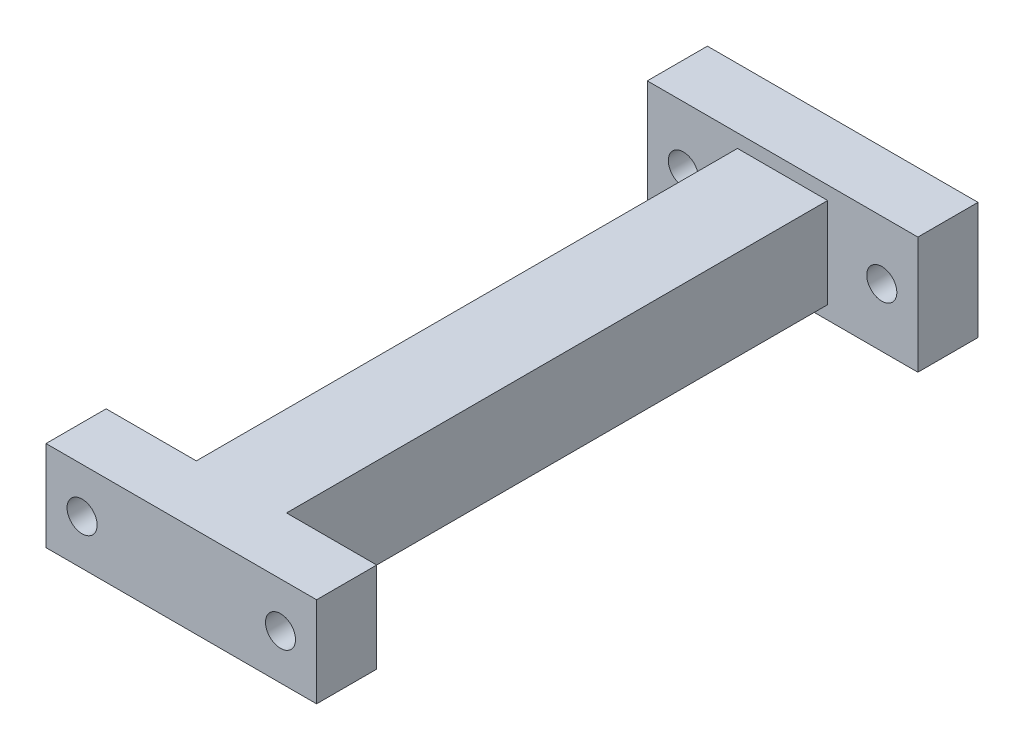
ISO-10303-21;
HEADER;
FILE_DESCRIPTION(('STEP AP214'),'2;1');
FILE_NAME('part.step','',(''),(''),'','','');
FILE_SCHEMA(('AUTOMOTIVE_DESIGN { 1 0 10303 214 1 1 1 1 }'));
ENDSEC;
DATA;
#1=APPLICATION_CONTEXT('core data for automotive mechanical design processes');
#2=APPLICATION_PROTOCOL_DEFINITION('international standard','automotive_design',2000,#1);
#3=PRODUCT_CONTEXT('',#1,'mechanical');
#4=PRODUCT('Part','Part','',(#3));
#5=PRODUCT_RELATED_PRODUCT_CATEGORY('part','',(#4));
#6=PRODUCT_DEFINITION_FORMATION('','',#4);
#7=PRODUCT_DEFINITION_CONTEXT('part definition',#1,'design');
#8=PRODUCT_DEFINITION('design','',#6,#7);
#9=PRODUCT_DEFINITION_SHAPE('','',#8);
#10=(LENGTH_UNIT() NAMED_UNIT(*) SI_UNIT(.MILLI.,.METRE.));
#11=(NAMED_UNIT(*) PLANE_ANGLE_UNIT() SI_UNIT($,.RADIAN.));
#12=(NAMED_UNIT(*) SI_UNIT($,.STERADIAN.) SOLID_ANGLE_UNIT());
#13=UNCERTAINTY_MEASURE_WITH_UNIT(LENGTH_MEASURE(1.E-05),#10,'distance_accuracy_value','');
#14=(GEOMETRIC_REPRESENTATION_CONTEXT(3) GLOBAL_UNCERTAINTY_ASSIGNED_CONTEXT((#13)) GLOBAL_UNIT_ASSIGNED_CONTEXT((#10,
#11,#12)) REPRESENTATION_CONTEXT('',''));
#15=CARTESIAN_POINT('',(0.,0.,0.));
#16=DIRECTION('',(0.,0.,1.));
#17=DIRECTION('',(1.,0.,0.));
#18=AXIS2_PLACEMENT_3D('',#15,#16,#17);
#19=CARTESIAN_POINT('',(-7.5,-7.5,110.));
#20=DIRECTION('',(1.,0.,0.));
#21=DIRECTION('',(0.,0.,-1.));
#22=AXIS2_PLACEMENT_3D('',#19,#20,#21);
#23=PLANE('',#22);
#24=DIRECTION('',(0.,1.,0.));
#25=VECTOR('',#24,1.);
#26=CARTESIAN_POINT('',(-7.5,-7.5,9.99999999999999));
#27=LINE('',#26,#25);
#28=CARTESIAN_POINT('',(-7.5,-7.5,9.99999999999999));
#29=VERTEX_POINT('',#28);
#30=CARTESIAN_POINT('',(-7.5,7.5,9.99999999999999));
#31=VERTEX_POINT('',#30);
#32=EDGE_CURVE('E66',#29,#31,#27,.T.);
#33=ORIENTED_EDGE('',*,*,#32,.F.);
#34=DIRECTION('',(0.,0.,-1.));
#35=VECTOR('',#34,1.);
#36=CARTESIAN_POINT('',(-7.5,-7.5,110.));
#37=LINE('',#36,#35);
#38=CARTESIAN_POINT('',(-7.49999999999999,-7.5,100.));
#39=VERTEX_POINT('',#38);
#40=EDGE_CURVE('E51',#39,#29,#37,.T.);
#41=ORIENTED_EDGE('',*,*,#40,.F.);
#42=DIRECTION('',(0.,-1.,0.));
#43=VECTOR('',#42,1.);
#44=CARTESIAN_POINT('',(-7.5,-7.5,100.));
#45=LINE('',#44,#43);
#46=CARTESIAN_POINT('',(-7.49999999999999,7.5,100.));
#47=VERTEX_POINT('',#46);
#48=EDGE_CURVE('E256',#47,#39,#45,.T.);
#49=ORIENTED_EDGE('',*,*,#48,.F.);
#50=DIRECTION('',(0.,0.,-1.));
#51=VECTOR('',#50,1.);
#52=CARTESIAN_POINT('',(-7.5,7.5,110.));
#53=LINE('',#52,#51);
#54=EDGE_CURVE('E265',#47,#31,#53,.T.);
#55=ORIENTED_EDGE('',*,*,#54,.T.);
#56=EDGE_LOOP('',(#33,#41,#49,#55));
#57=FACE_BOUND('',#56,.T.);
#58=ADVANCED_FACE('F43',(#57),#23,.F.);
#59=CARTESIAN_POINT('',(7.5,-7.5,110.));
#60=DIRECTION('',(-1.,0.,0.));
#61=DIRECTION('',(0.,0.,1.));
#62=AXIS2_PLACEMENT_3D('',#59,#60,#61);
#63=PLANE('',#62);
#64=DIRECTION('',(0.,-1.,0.));
#65=VECTOR('',#64,1.);
#66=CARTESIAN_POINT('',(7.5,-7.5,9.99999999999999));
#67=LINE('',#66,#65);
#68=CARTESIAN_POINT('',(7.5,7.5,9.99999999999999));
#69=VERTEX_POINT('',#68);
#70=CARTESIAN_POINT('',(7.5,-7.5,9.99999999999999));
#71=VERTEX_POINT('',#70);
#72=EDGE_CURVE('E188',#69,#71,#67,.T.);
#73=ORIENTED_EDGE('',*,*,#72,.F.);
#74=DIRECTION('',(0.,0.,-1.));
#75=VECTOR('',#74,1.);
#76=CARTESIAN_POINT('',(7.5,7.5,110.));
#77=LINE('',#76,#75);
#78=CARTESIAN_POINT('',(7.5,7.5,100.));
#79=VERTEX_POINT('',#78);
#80=EDGE_CURVE('E268',#79,#69,#77,.T.);
#81=ORIENTED_EDGE('',*,*,#80,.F.);
#82=DIRECTION('',(0.,1.,0.));
#83=VECTOR('',#82,1.);
#84=CARTESIAN_POINT('',(7.5,-7.5,100.));
#85=LINE('',#84,#83);
#86=CARTESIAN_POINT('',(7.5,-7.5,100.));
#87=VERTEX_POINT('',#86);
#88=EDGE_CURVE('E242',#87,#79,#85,.T.);
#89=ORIENTED_EDGE('',*,*,#88,.F.);
#90=DIRECTION('',(0.,0.,-1.));
#91=VECTOR('',#90,1.);
#92=CARTESIAN_POINT('',(7.5,-7.5,110.));
#93=LINE('',#92,#91);
#94=EDGE_CURVE('E271',#87,#71,#93,.T.);
#95=ORIENTED_EDGE('',*,*,#94,.T.);
#96=EDGE_LOOP('',(#73,#81,#89,#95));
#97=FACE_BOUND('',#96,.T.);
#98=ADVANCED_FACE('F301',(#97),#63,.F.);
#99=CARTESIAN_POINT('',(7.5,-7.5,110.));
#100=DIRECTION('',(0.,1.,0.));
#101=DIRECTION('',(-1.,0.,0.));
#102=AXIS2_PLACEMENT_3D('',#99,#100,#101);
#103=PLANE('',#102);
#104=DIRECTION('',(-1.,0.,0.));
#105=VECTOR('',#104,1.);
#106=CARTESIAN_POINT('',(7.5,-7.5,9.99999999999999));
#107=LINE('',#106,#105);
#108=EDGE_CURVE('E58',#71,#29,#107,.T.);
#109=ORIENTED_EDGE('',*,*,#108,.F.);
#110=ORIENTED_EDGE('',*,*,#94,.F.);
#111=DIRECTION('',(1.,0.,0.));
#112=VECTOR('',#111,1.);
#113=CARTESIAN_POINT('',(22.5,-7.5,100.));
#114=LINE('',#113,#112);
#115=CARTESIAN_POINT('',(22.5,-7.5,100.));
#116=VERTEX_POINT('',#115);
#117=EDGE_CURVE('E214',#87,#116,#114,.T.);
#118=ORIENTED_EDGE('',*,*,#117,.T.);
#119=DIRECTION('',(0.,0.,1.));
#120=VECTOR('',#119,1.);
#121=CARTESIAN_POINT('',(22.5,-7.5,100.));
#122=LINE('',#121,#120);
#123=CARTESIAN_POINT('',(22.5,-7.5,110.));
#124=VERTEX_POINT('',#123);
#125=EDGE_CURVE('E247',#116,#124,#122,.T.);
#126=ORIENTED_EDGE('',*,*,#125,.T.);
#127=DIRECTION('',(1.,0.,0.));
#128=VECTOR('',#127,1.);
#129=CARTESIAN_POINT('',(7.5,-7.5,110.));
#130=LINE('',#129,#128);
#131=CARTESIAN_POINT('',(-22.5,-7.5,110.));
#132=VERTEX_POINT('',#131);
#133=EDGE_CURVE('E259',#132,#124,#130,.T.);
#134=ORIENTED_EDGE('',*,*,#133,.F.);
#135=DIRECTION('',(0.,0.,1.));
#136=VECTOR('',#135,1.);
#137=CARTESIAN_POINT('',(-22.5,-7.5,100.));
#138=LINE('',#137,#136);
#139=CARTESIAN_POINT('',(-22.5,-7.5,100.));
#140=VERTEX_POINT('',#139);
#141=EDGE_CURVE('E229',#140,#132,#138,.T.);
#142=ORIENTED_EDGE('',*,*,#141,.F.);
#143=EDGE_CURVE('E216',#140,#39,#114,.T.);
#144=ORIENTED_EDGE('',*,*,#143,.T.);
#145=ORIENTED_EDGE('',*,*,#40,.T.);
#146=EDGE_LOOP('',(#109,#110,#118,#126,#134,#142,#144,#145));
#147=FACE_BOUND('',#146,.T.);
#148=ADVANCED_FACE('F305',(#147),#103,.F.);
#149=CARTESIAN_POINT('',(7.5,7.5,110.));
#150=DIRECTION('',(0.,-1.,0.));
#151=DIRECTION('',(1.,0.,0.));
#152=AXIS2_PLACEMENT_3D('',#149,#150,#151);
#153=PLANE('',#152);
#154=DIRECTION('',(1.,0.,0.));
#155=VECTOR('',#154,1.);
#156=CARTESIAN_POINT('',(7.5,7.5,9.99999999999999));
#157=LINE('',#156,#155);
#158=EDGE_CURVE('E11',#31,#69,#157,.T.);
#159=ORIENTED_EDGE('',*,*,#158,.F.);
#160=ORIENTED_EDGE('',*,*,#54,.F.);
#161=DIRECTION('',(-1.,0.,0.));
#162=VECTOR('',#161,1.);
#163=CARTESIAN_POINT('',(22.5,7.5,100.));
#164=LINE('',#163,#162);
#165=CARTESIAN_POINT('',(-22.5,7.5,100.));
#166=VERTEX_POINT('',#165);
#167=EDGE_CURVE('E224',#47,#166,#164,.T.);
#168=ORIENTED_EDGE('',*,*,#167,.T.);
#169=DIRECTION('',(0.,0.,1.));
#170=VECTOR('',#169,1.);
#171=CARTESIAN_POINT('',(-22.5,7.5,100.));
#172=LINE('',#171,#170);
#173=CARTESIAN_POINT('',(-22.5,7.5,110.));
#174=VERTEX_POINT('',#173);
#175=EDGE_CURVE('E238',#166,#174,#172,.T.);
#176=ORIENTED_EDGE('',*,*,#175,.T.);
#177=DIRECTION('',(-1.,0.,0.));
#178=VECTOR('',#177,1.);
#179=CARTESIAN_POINT('',(7.5,7.5,110.));
#180=LINE('',#179,#178);
#181=CARTESIAN_POINT('',(22.5,7.5,110.));
#182=VERTEX_POINT('',#181);
#183=EDGE_CURVE('E262',#182,#174,#180,.T.);
#184=ORIENTED_EDGE('',*,*,#183,.F.);
#185=DIRECTION('',(0.,0.,1.));
#186=VECTOR('',#185,1.);
#187=CARTESIAN_POINT('',(22.5,7.5,100.));
#188=LINE('',#187,#186);
#189=CARTESIAN_POINT('',(22.5,7.5,100.));
#190=VERTEX_POINT('',#189);
#191=EDGE_CURVE('E243',#190,#182,#188,.T.);
#192=ORIENTED_EDGE('',*,*,#191,.F.);
#193=EDGE_CURVE('E225',#190,#79,#164,.T.);
#194=ORIENTED_EDGE('',*,*,#193,.T.);
#195=ORIENTED_EDGE('',*,*,#80,.T.);
#196=EDGE_LOOP('',(#159,#160,#168,#176,#184,#192,#194,#195));
#197=FACE_BOUND('',#196,.T.);
#198=ADVANCED_FACE('F311',(#197),#153,.F.);
#199=CARTESIAN_POINT('',(0.,0.,110.));
#200=DIRECTION('',(0.,0.,1.));
#201=DIRECTION('',(1.,0.,0.));
#202=AXIS2_PLACEMENT_3D('',#199,#200,#201);
#203=PLANE('',#202);
#204=CARTESIAN_POINT('',(-16.5,0.,110.));
#205=DIRECTION('',(0.,0.,1.));
#206=DIRECTION('',(1.,0.,0.));
#207=AXIS2_PLACEMENT_3D('',#204,#205,#206);
#208=CIRCLE('',#207,2.5);
#209=CARTESIAN_POINT('',(-14.,0.,110.));
#210=VERTEX_POINT('',#209);
#211=EDGE_CURVE('E202',#210,#210,#208,.T.);
#212=ORIENTED_EDGE('',*,*,#211,.F.);
#213=EDGE_LOOP('',(#212));
#214=FACE_BOUND('',#213,.T.);
#215=CARTESIAN_POINT('',(16.5,0.,110.));
#216=DIRECTION('',(0.,0.,1.));
#217=DIRECTION('',(-1.,0.,0.));
#218=AXIS2_PLACEMENT_3D('',#215,#216,#217);
#219=CIRCLE('',#218,2.5);
#220=CARTESIAN_POINT('',(14.,0.,110.));
#221=VERTEX_POINT('',#220);
#222=EDGE_CURVE('E201',#221,#221,#219,.T.);
#223=ORIENTED_EDGE('',*,*,#222,.F.);
#224=EDGE_LOOP('',(#223));
#225=FACE_BOUND('',#224,.T.);
#226=ORIENTED_EDGE('',*,*,#183,.T.);
#227=DIRECTION('',(0.,-1.,0.));
#228=VECTOR('',#227,1.);
#229=CARTESIAN_POINT('',(-22.5,-7.5,110.));
#230=LINE('',#229,#228);
#231=EDGE_CURVE('E230',#174,#132,#230,.T.);
#232=ORIENTED_EDGE('',*,*,#231,.T.);
#233=ORIENTED_EDGE('',*,*,#133,.T.);
#234=DIRECTION('',(0.,1.,0.));
#235=VECTOR('',#234,1.);
#236=CARTESIAN_POINT('',(22.5,-7.5,110.));
#237=LINE('',#236,#235);
#238=EDGE_CURVE('E215',#124,#182,#237,.T.);
#239=ORIENTED_EDGE('',*,*,#238,.T.);
#240=EDGE_LOOP('',(#226,#232,#233,#239));
#241=FACE_BOUND('',#240,.T.);
#242=ADVANCED_FACE('F316',(#214,#225,#241),#203,.T.);
#243=CARTESIAN_POINT('',(22.5,-7.5,100.));
#244=DIRECTION('',(1.,0.,0.));
#245=DIRECTION('',(0.,0.,-1.));
#246=AXIS2_PLACEMENT_3D('',#243,#244,#245);
#247=PLANE('',#246);
#248=ORIENTED_EDGE('',*,*,#238,.F.);
#249=ORIENTED_EDGE('',*,*,#125,.F.);
#250=DIRECTION('',(0.,1.,0.));
#251=VECTOR('',#250,1.);
#252=CARTESIAN_POINT('',(22.5,-7.5,100.));
#253=LINE('',#252,#251);
#254=EDGE_CURVE('E220',#116,#190,#253,.T.);
#255=ORIENTED_EDGE('',*,*,#254,.T.);
#256=ORIENTED_EDGE('',*,*,#191,.T.);
#257=EDGE_LOOP('',(#248,#249,#255,#256));
#258=FACE_BOUND('',#257,.T.);
#259=ADVANCED_FACE('F325',(#258),#247,.T.);
#260=CARTESIAN_POINT('',(0.,0.,100.));
#261=DIRECTION('',(0.,0.,1.));
#262=DIRECTION('',(1.,0.,0.));
#263=AXIS2_PLACEMENT_3D('',#260,#261,#262);
#264=PLANE('',#263);
#265=CARTESIAN_POINT('',(16.5,0.,100.));
#266=DIRECTION('',(0.,0.,1.));
#267=DIRECTION('',(1.,0.,0.));
#268=AXIS2_PLACEMENT_3D('',#265,#266,#267);
#269=CIRCLE('',#268,2.5);
#270=CARTESIAN_POINT('',(19.,0.,100.));
#271=VERTEX_POINT('',#270);
#272=EDGE_CURVE('E234',#271,#271,#269,.T.);
#273=ORIENTED_EDGE('',*,*,#272,.T.);
#274=EDGE_LOOP('',(#273));
#275=FACE_BOUND('',#274,.T.);
#276=ORIENTED_EDGE('',*,*,#117,.F.);
#277=ORIENTED_EDGE('',*,*,#88,.T.);
#278=ORIENTED_EDGE('',*,*,#193,.F.);
#279=ORIENTED_EDGE('',*,*,#254,.F.);
#280=EDGE_LOOP('',(#276,#277,#278,#279));
#281=FACE_BOUND('',#280,.T.);
#282=ADVANCED_FACE('F282',(#275,#281),#264,.F.);
#283=CARTESIAN_POINT('',(-16.5,0.,100.));
#284=DIRECTION('',(0.,0.,1.));
#285=DIRECTION('',(1.,0.,0.));
#286=AXIS2_PLACEMENT_3D('',#283,#284,#285);
#287=CIRCLE('',#286,2.5);
#288=CARTESIAN_POINT('',(-14.,0.,100.));
#289=VERTEX_POINT('',#288);
#290=EDGE_CURVE('E206',#289,#289,#287,.T.);
#291=ORIENTED_EDGE('',*,*,#290,.T.);
#292=EDGE_LOOP('',(#291));
#293=FACE_BOUND('',#292,.T.);
#294=ORIENTED_EDGE('',*,*,#167,.F.);
#295=ORIENTED_EDGE('',*,*,#48,.T.);
#296=ORIENTED_EDGE('',*,*,#143,.F.);
#297=DIRECTION('',(0.,-1.,0.));
#298=VECTOR('',#297,1.);
#299=CARTESIAN_POINT('',(-22.5,-7.5,100.));
#300=LINE('',#299,#298);
#301=EDGE_CURVE('E210',#166,#140,#300,.T.);
#302=ORIENTED_EDGE('',*,*,#301,.F.);
#303=EDGE_LOOP('',(#294,#295,#296,#302));
#304=FACE_BOUND('',#303,.T.);
#305=ADVANCED_FACE('F329',(#293,#304),#264,.F.);
#306=CARTESIAN_POINT('',(-22.5,-7.5,100.));
#307=DIRECTION('',(-1.,0.,0.));
#308=DIRECTION('',(0.,0.,1.));
#309=AXIS2_PLACEMENT_3D('',#306,#307,#308);
#310=PLANE('',#309);
#311=ORIENTED_EDGE('',*,*,#231,.F.);
#312=ORIENTED_EDGE('',*,*,#175,.F.);
#313=ORIENTED_EDGE('',*,*,#301,.T.);
#314=ORIENTED_EDGE('',*,*,#141,.T.);
#315=EDGE_LOOP('',(#311,#312,#313,#314));
#316=FACE_BOUND('',#315,.T.);
#317=ADVANCED_FACE('F296',(#316),#310,.T.);
#318=CARTESIAN_POINT('',(-16.5,0.,90.));
#319=DIRECTION('',(0.,0.,1.));
#320=DIRECTION('',(1.,0.,0.));
#321=AXIS2_PLACEMENT_3D('',#318,#319,#320);
#322=CYLINDRICAL_SURFACE('',#321,2.5);
#323=ORIENTED_EDGE('',*,*,#211,.T.);
#324=EDGE_LOOP('',(#323));
#325=FACE_BOUND('',#324,.T.);
#326=ORIENTED_EDGE('',*,*,#290,.F.);
#327=EDGE_LOOP('',(#326));
#328=FACE_BOUND('',#327,.T.);
#329=ADVANCED_FACE('F287',(#325,#328),#322,.F.);
#330=CARTESIAN_POINT('',(16.5,0.,90.));
#331=DIRECTION('',(0.,0.,1.));
#332=DIRECTION('',(1.,0.,0.));
#333=AXIS2_PLACEMENT_3D('',#330,#331,#332);
#334=CYLINDRICAL_SURFACE('',#333,2.5);
#335=ORIENTED_EDGE('',*,*,#222,.T.);
#336=EDGE_LOOP('',(#335));
#337=FACE_BOUND('',#336,.T.);
#338=ORIENTED_EDGE('',*,*,#272,.F.);
#339=EDGE_LOOP('',(#338));
#340=FACE_BOUND('',#339,.T.);
#341=ADVANCED_FACE('F285',(#337,#340),#334,.F.);
#342=CARTESIAN_POINT('',(0.,0.,10.));
#343=DIRECTION('',(0.,0.,-1.));
#344=DIRECTION('',(-1.,0.,0.));
#345=AXIS2_PLACEMENT_3D('',#342,#343,#344);
#346=PLANE('',#345);
#347=CARTESIAN_POINT('',(16.5,0.,9.99999999999999));
#348=DIRECTION('',(0.,0.,-1.));
#349=DIRECTION('',(-1.,0.,0.));
#350=AXIS2_PLACEMENT_3D('',#347,#348,#349);
#351=CIRCLE('',#350,2.5);
#352=CARTESIAN_POINT('',(14.,0.,9.99999999999999));
#353=VERTEX_POINT('',#352);
#354=EDGE_CURVE('E171',#353,#353,#351,.T.);
#355=ORIENTED_EDGE('',*,*,#354,.T.);
#356=EDGE_LOOP('',(#355));
#357=FACE_BOUND('',#356,.T.);
#358=CARTESIAN_POINT('',(-16.5,0.,9.99999999999999));
#359=DIRECTION('',(0.,0.,-1.));
#360=DIRECTION('',(-1.,0.,0.));
#361=AXIS2_PLACEMENT_3D('',#358,#359,#360);
#362=CIRCLE('',#361,2.5);
#363=CARTESIAN_POINT('',(-19.,0.,9.99999999999999));
#364=VERTEX_POINT('',#363);
#365=EDGE_CURVE('E540',#364,#364,#362,.T.);
#366=ORIENTED_EDGE('',*,*,#365,.T.);
#367=EDGE_LOOP('',(#366));
#368=FACE_BOUND('',#367,.T.);
#369=DIRECTION('',(0.,-1.,0.));
#370=VECTOR('',#369,1.);
#371=CARTESIAN_POINT('',(22.5,-9.73638284610195,10.));
#372=LINE('',#371,#370);
#373=CARTESIAN_POINT('',(22.5,9.73638284610195,10.));
#374=VERTEX_POINT('',#373);
#375=CARTESIAN_POINT('',(22.5,-9.73638284610195,10.));
#376=VERTEX_POINT('',#375);
#377=EDGE_CURVE('E155',#374,#376,#372,.T.);
#378=ORIENTED_EDGE('',*,*,#377,.F.);
#379=DIRECTION('',(1.,0.,0.));
#380=VECTOR('',#379,1.);
#381=CARTESIAN_POINT('',(-22.5,9.73638284610195,10.));
#382=LINE('',#381,#380);
#383=CARTESIAN_POINT('',(-22.5,9.73638284610195,10.));
#384=VERTEX_POINT('',#383);
#385=EDGE_CURVE('E147',#384,#374,#382,.T.);
#386=ORIENTED_EDGE('',*,*,#385,.F.);
#387=DIRECTION('',(0.,1.,0.));
#388=VECTOR('',#387,1.);
#389=CARTESIAN_POINT('',(-22.5,-9.73638284610194,10.));
#390=LINE('',#389,#388);
#391=CARTESIAN_POINT('',(-22.5,-9.73638284610194,10.));
#392=VERTEX_POINT('',#391);
#393=EDGE_CURVE('E158',#392,#384,#390,.T.);
#394=ORIENTED_EDGE('',*,*,#393,.F.);
#395=DIRECTION('',(-1.,0.,0.));
#396=VECTOR('',#395,1.);
#397=CARTESIAN_POINT('',(-22.5,-9.73638284610194,10.));
#398=LINE('',#397,#396);
#399=EDGE_CURVE('E138',#376,#392,#398,.T.);
#400=ORIENTED_EDGE('',*,*,#399,.F.);
#401=EDGE_LOOP('',(#378,#386,#394,#400));
#402=FACE_BOUND('',#401,.T.);
#403=ORIENTED_EDGE('',*,*,#72,.T.);
#404=ORIENTED_EDGE('',*,*,#108,.T.);
#405=ORIENTED_EDGE('',*,*,#32,.T.);
#406=ORIENTED_EDGE('',*,*,#158,.T.);
#407=EDGE_LOOP('',(#403,#404,#405,#406));
#408=FACE_BOUND('',#407,.T.);
#409=ADVANCED_FACE('F152',(#357,#368,#402,#408),#346,.F.);
#410=CARTESIAN_POINT('',(22.5,-9.73638284610195,10.));
#411=DIRECTION('',(1.,0.,0.));
#412=DIRECTION('',(0.,0.,-1.));
#413=AXIS2_PLACEMENT_3D('',#410,#411,#412);
#414=PLANE('',#413);
#415=DIRECTION('',(0.,-1.,0.));
#416=VECTOR('',#415,1.);
#417=CARTESIAN_POINT('',(22.5,-9.73638284610195,0.));
#418=LINE('',#417,#416);
#419=CARTESIAN_POINT('',(22.5,9.73638284610195,0.));
#420=VERTEX_POINT('',#419);
#421=CARTESIAN_POINT('',(22.5,-9.73638284610195,0.));
#422=VERTEX_POINT('',#421);
#423=EDGE_CURVE('E178',#420,#422,#418,.T.);
#424=ORIENTED_EDGE('',*,*,#423,.F.);
#425=DIRECTION('',(0.,0.,-1.));
#426=VECTOR('',#425,1.);
#427=CARTESIAN_POINT('',(22.5,9.73638284610195,10.));
#428=LINE('',#427,#426);
#429=EDGE_CURVE('E162',#374,#420,#428,.T.);
#430=ORIENTED_EDGE('',*,*,#429,.F.);
#431=ORIENTED_EDGE('',*,*,#377,.T.);
#432=DIRECTION('',(0.,0.,-1.));
#433=VECTOR('',#432,1.);
#434=CARTESIAN_POINT('',(22.5,-9.73638284610195,10.));
#435=LINE('',#434,#433);
#436=EDGE_CURVE('E135',#376,#422,#435,.T.);
#437=ORIENTED_EDGE('',*,*,#436,.T.);
#438=EDGE_LOOP('',(#424,#430,#431,#437));
#439=FACE_BOUND('',#438,.T.);
#440=ADVANCED_FACE('F161',(#439),#414,.T.);
#441=CARTESIAN_POINT('',(-22.5,9.73638284610195,10.));
#442=DIRECTION('',(0.,1.,0.));
#443=DIRECTION('',(-1.,0.,0.));
#444=AXIS2_PLACEMENT_3D('',#441,#442,#443);
#445=PLANE('',#444);
#446=DIRECTION('',(1.,0.,0.));
#447=VECTOR('',#446,1.);
#448=CARTESIAN_POINT('',(-22.5,9.73638284610195,0.));
#449=LINE('',#448,#447);
#450=CARTESIAN_POINT('',(-22.5,9.73638284610195,0.));
#451=VERTEX_POINT('',#450);
#452=EDGE_CURVE('E164',#451,#420,#449,.T.);
#453=ORIENTED_EDGE('',*,*,#452,.F.);
#454=DIRECTION('',(0.,0.,-1.));
#455=VECTOR('',#454,1.);
#456=CARTESIAN_POINT('',(-22.5,9.73638284610195,10.));
#457=LINE('',#456,#455);
#458=EDGE_CURVE('E189',#384,#451,#457,.T.);
#459=ORIENTED_EDGE('',*,*,#458,.F.);
#460=ORIENTED_EDGE('',*,*,#385,.T.);
#461=ORIENTED_EDGE('',*,*,#429,.T.);
#462=EDGE_LOOP('',(#453,#459,#460,#461));
#463=FACE_BOUND('',#462,.T.);
#464=ADVANCED_FACE('F494',(#463),#445,.T.);
#465=CARTESIAN_POINT('',(-22.5,-9.73638284610194,10.));
#466=DIRECTION('',(-1.,0.,0.));
#467=DIRECTION('',(0.,0.,1.));
#468=AXIS2_PLACEMENT_3D('',#465,#466,#467);
#469=PLANE('',#468);
#470=DIRECTION('',(0.,1.,0.));
#471=VECTOR('',#470,1.);
#472=CARTESIAN_POINT('',(-22.5,-9.73638284610194,0.));
#473=LINE('',#472,#471);
#474=CARTESIAN_POINT('',(-22.5,-9.73638284610194,0.));
#475=VERTEX_POINT('',#474);
#476=EDGE_CURVE('E168',#475,#451,#473,.T.);
#477=ORIENTED_EDGE('',*,*,#476,.F.);
#478=DIRECTION('',(0.,0.,-1.));
#479=VECTOR('',#478,1.);
#480=CARTESIAN_POINT('',(-22.5,-9.73638284610194,10.));
#481=LINE('',#480,#479);
#482=EDGE_CURVE('E146',#392,#475,#481,.T.);
#483=ORIENTED_EDGE('',*,*,#482,.F.);
#484=ORIENTED_EDGE('',*,*,#393,.T.);
#485=ORIENTED_EDGE('',*,*,#458,.T.);
#486=EDGE_LOOP('',(#477,#483,#484,#485));
#487=FACE_BOUND('',#486,.T.);
#488=ADVANCED_FACE('F488',(#487),#469,.T.);
#489=CARTESIAN_POINT('',(-22.5,-9.73638284610194,10.));
#490=DIRECTION('',(0.,-1.,0.));
#491=DIRECTION('',(1.,0.,0.));
#492=AXIS2_PLACEMENT_3D('',#489,#490,#491);
#493=PLANE('',#492);
#494=DIRECTION('',(-1.,0.,0.));
#495=VECTOR('',#494,1.);
#496=CARTESIAN_POINT('',(-22.5,-9.73638284610194,0.));
#497=LINE('',#496,#495);
#498=EDGE_CURVE('E140',#422,#475,#497,.T.);
#499=ORIENTED_EDGE('',*,*,#498,.F.);
#500=ORIENTED_EDGE('',*,*,#436,.F.);
#501=ORIENTED_EDGE('',*,*,#399,.T.);
#502=ORIENTED_EDGE('',*,*,#482,.T.);
#503=EDGE_LOOP('',(#499,#500,#501,#502));
#504=FACE_BOUND('',#503,.T.);
#505=ADVANCED_FACE('F137',(#504),#493,.T.);
#506=CARTESIAN_POINT('',(0.,0.,0.));
#507=DIRECTION('',(0.,0.,1.));
#508=DIRECTION('',(1.,0.,0.));
#509=AXIS2_PLACEMENT_3D('',#506,#507,#508);
#510=PLANE('',#509);
#511=CARTESIAN_POINT('',(16.5,0.,0.));
#512=DIRECTION('',(0.,0.,-1.));
#513=DIRECTION('',(-1.,0.,0.));
#514=AXIS2_PLACEMENT_3D('',#511,#512,#513);
#515=CIRCLE('',#514,2.5);
#516=CARTESIAN_POINT('',(14.,0.,0.));
#517=VERTEX_POINT('',#516);
#518=EDGE_CURVE('E536',#517,#517,#515,.T.);
#519=ORIENTED_EDGE('',*,*,#518,.F.);
#520=EDGE_LOOP('',(#519));
#521=FACE_BOUND('',#520,.T.);
#522=CARTESIAN_POINT('',(-16.5,0.,0.));
#523=DIRECTION('',(0.,0.,-1.));
#524=DIRECTION('',(-1.,0.,0.));
#525=AXIS2_PLACEMENT_3D('',#522,#523,#524);
#526=CIRCLE('',#525,2.5);
#527=CARTESIAN_POINT('',(-19.,0.,0.));
#528=VERTEX_POINT('',#527);
#529=EDGE_CURVE('E546',#528,#528,#526,.T.);
#530=ORIENTED_EDGE('',*,*,#529,.F.);
#531=EDGE_LOOP('',(#530));
#532=FACE_BOUND('',#531,.T.);
#533=ORIENTED_EDGE('',*,*,#423,.T.);
#534=ORIENTED_EDGE('',*,*,#498,.T.);
#535=ORIENTED_EDGE('',*,*,#476,.T.);
#536=ORIENTED_EDGE('',*,*,#452,.T.);
#537=EDGE_LOOP('',(#533,#534,#535,#536));
#538=FACE_BOUND('',#537,.T.);
#539=ADVANCED_FACE('F318',(#521,#532,#538),#510,.F.);
#540=CARTESIAN_POINT('',(-16.5,0.,110.));
#541=DIRECTION('',(0.,0.,-1.));
#542=DIRECTION('',(-1.,0.,0.));
#543=AXIS2_PLACEMENT_3D('',#540,#541,#542);
#544=CYLINDRICAL_SURFACE('',#543,2.5);
#545=ORIENTED_EDGE('',*,*,#529,.T.);
#546=EDGE_LOOP('',(#545));
#547=FACE_BOUND('',#546,.T.);
#548=ORIENTED_EDGE('',*,*,#365,.F.);
#549=EDGE_LOOP('',(#548));
#550=FACE_BOUND('',#549,.T.);
#551=ADVANCED_FACE('F321',(#547,#550),#544,.F.);
#552=CARTESIAN_POINT('',(16.5,0.,110.));
#553=DIRECTION('',(0.,0.,-1.));
#554=DIRECTION('',(-1.,0.,0.));
#555=AXIS2_PLACEMENT_3D('',#552,#553,#554);
#556=CYLINDRICAL_SURFACE('',#555,2.5);
#557=ORIENTED_EDGE('',*,*,#518,.T.);
#558=EDGE_LOOP('',(#557));
#559=FACE_BOUND('',#558,.T.);
#560=ORIENTED_EDGE('',*,*,#354,.F.);
#561=EDGE_LOOP('',(#560));
#562=FACE_BOUND('',#561,.T.);
#563=ADVANCED_FACE('F468',(#559,#562),#556,.F.);
#564=CLOSED_SHELL('',(#58,#98,#148,#198,#242,#259,#282,#305,#317,#329,#341,#409,#440,#464,#488,
#505,#539,#551,#563));
#565=MANIFOLD_SOLID_BREP('B2',#564);
#566=ADVANCED_BREP_SHAPE_REPRESENTATION('',(#18,#565),#14);
#567=SHAPE_DEFINITION_REPRESENTATION(#9,#566);
ENDSEC;
END-ISO-10303-21;
